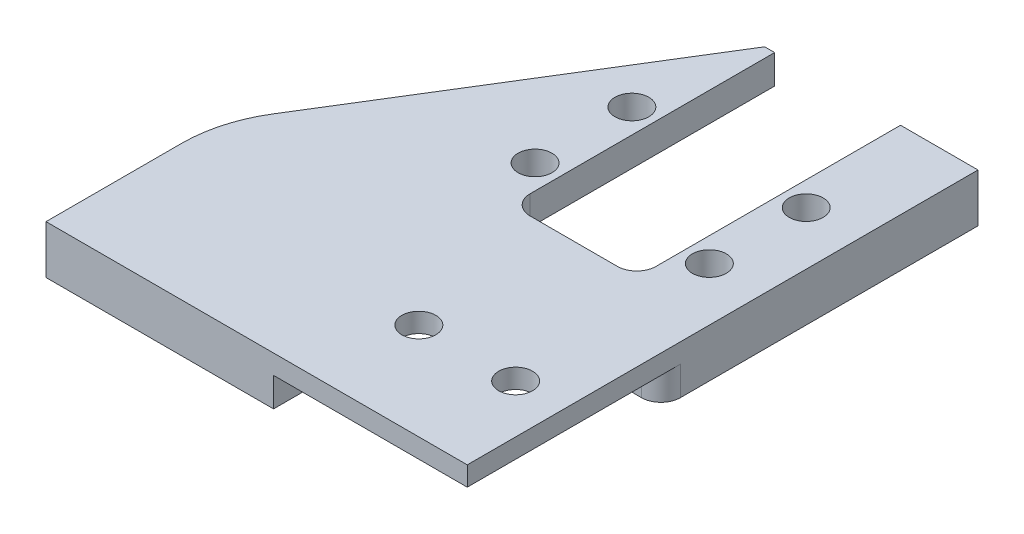
ISO-10303-21;
HEADER;
FILE_DESCRIPTION(('STEP AP214'),'2;1');
FILE_NAME('part.step','',(''),(''),'','','');
FILE_SCHEMA(('AUTOMOTIVE_DESIGN { 1 0 10303 214 1 1 1 1 }'));
ENDSEC;
DATA;
#1=APPLICATION_CONTEXT('core data for automotive mechanical design processes');
#2=APPLICATION_PROTOCOL_DEFINITION('international standard','automotive_design',2000,#1);
#3=PRODUCT_CONTEXT('',#1,'mechanical');
#4=PRODUCT('Part','Part','',(#3));
#5=PRODUCT_RELATED_PRODUCT_CATEGORY('part','',(#4));
#6=PRODUCT_DEFINITION_FORMATION('','',#4);
#7=PRODUCT_DEFINITION_CONTEXT('part definition',#1,'design');
#8=PRODUCT_DEFINITION('design','',#6,#7);
#9=PRODUCT_DEFINITION_SHAPE('','',#8);
#10=(LENGTH_UNIT() NAMED_UNIT(*) SI_UNIT(.MILLI.,.METRE.));
#11=(NAMED_UNIT(*) PLANE_ANGLE_UNIT() SI_UNIT($,.RADIAN.));
#12=(NAMED_UNIT(*) SI_UNIT($,.STERADIAN.) SOLID_ANGLE_UNIT());
#13=UNCERTAINTY_MEASURE_WITH_UNIT(LENGTH_MEASURE(1.E-05),#10,'distance_accuracy_value','');
#14=(GEOMETRIC_REPRESENTATION_CONTEXT(3) GLOBAL_UNCERTAINTY_ASSIGNED_CONTEXT((#13)) GLOBAL_UNIT_ASSIGNED_CONTEXT((#10,
#11,#12)) REPRESENTATION_CONTEXT('',''));
#15=CARTESIAN_POINT('',(0.,0.,0.));
#16=DIRECTION('',(0.,0.,1.));
#17=DIRECTION('',(1.,0.,0.));
#18=AXIS2_PLACEMENT_3D('',#15,#16,#17);
#19=CARTESIAN_POINT('',(121.75,4.,-9.));
#20=DIRECTION('',(0.,1.,0.));
#21=DIRECTION('',(0.,0.,1.));
#22=AXIS2_PLACEMENT_3D('',#19,#20,#21);
#23=PLANE('',#22);
#24=CARTESIAN_POINT('',(-48.25,4.,-16.25));
#25=DIRECTION('',(0.,-1.,0.));
#26=DIRECTION('',(0.,0.,-1.));
#27=AXIS2_PLACEMENT_3D('',#24,#25,#26);
#28=CIRCLE('',#27,7.);
#29=CARTESIAN_POINT('',(-48.25,4.,-23.25));
#30=VERTEX_POINT('',#29);
#31=EDGE_CURVE('E447',#30,#30,#28,.T.);
#32=ORIENTED_EDGE('',*,*,#31,.F.);
#33=EDGE_LOOP('',(#32));
#34=FACE_BOUND('',#33,.T.);
#35=DIRECTION('',(0.,0.,-1.));
#36=VECTOR('',#35,1.);
#37=CARTESIAN_POINT('',(-18.75,4.,-9.00000000000005));
#38=LINE('',#37,#36);
#39=CARTESIAN_POINT('',(-18.75,4.,-24.25));
#40=VERTEX_POINT('',#39);
#41=CARTESIAN_POINT('',(-18.75,4.,-54.9920433000686));
#42=VERTEX_POINT('',#41);
#43=EDGE_CURVE('E538',#40,#42,#38,.T.);
#44=ORIENTED_EDGE('',*,*,#43,.F.);
#45=CARTESIAN_POINT('',(-20.75,4.,-24.25));
#46=DIRECTION('',(0.,1.,0.));
#47=DIRECTION('',(0.,0.,1.));
#48=AXIS2_PLACEMENT_3D('',#45,#46,#47);
#49=CIRCLE('',#48,2.);
#50=CARTESIAN_POINT('',(-20.75,4.,-22.25));
#51=VERTEX_POINT('',#50);
#52=EDGE_CURVE('E310',#40,#51,#49,.F.);
#53=ORIENTED_EDGE('',*,*,#52,.T.);
#54=DIRECTION('',(1.,0.,0.));
#55=VECTOR('',#54,1.);
#56=CARTESIAN_POINT('',(-18.75,4.,-22.25));
#57=LINE('',#56,#55);
#58=CARTESIAN_POINT('',(-36.75,4.,-22.25));
#59=VERTEX_POINT('',#58);
#60=EDGE_CURVE('E215',#59,#51,#57,.T.);
#61=ORIENTED_EDGE('',*,*,#60,.F.);
#62=CARTESIAN_POINT('',(-36.75,4.,-20.25));
#63=DIRECTION('',(0.,1.,0.));
#64=DIRECTION('',(0.,0.,1.));
#65=AXIS2_PLACEMENT_3D('',#62,#63,#64);
#66=CIRCLE('',#65,2.);
#67=CARTESIAN_POINT('',(-38.75,4.,-20.25));
#68=VERTEX_POINT('',#67);
#69=EDGE_CURVE('E12',#59,#68,#66,.T.);
#70=ORIENTED_EDGE('',*,*,#69,.T.);
#71=DIRECTION('',(0.,0.,-1.));
#72=VECTOR('',#71,1.);
#73=CARTESIAN_POINT('',(-38.75,4.,-2.25));
#74=LINE('',#73,#72);
#75=CARTESIAN_POINT('',(-38.75,4.,-2.25));
#76=VERTEX_POINT('',#75);
#77=EDGE_CURVE('E557',#76,#68,#74,.T.);
#78=ORIENTED_EDGE('',*,*,#77,.F.);
#79=DIRECTION('',(1.,0.,0.));
#80=VECTOR('',#79,1.);
#81=CARTESIAN_POINT('',(-62.25,4.,-2.25));
#82=LINE('',#81,#80);
#83=CARTESIAN_POINT('',(-62.25,4.,-2.25));
#84=VERTEX_POINT('',#83);
#85=EDGE_CURVE('E247',#84,#76,#82,.T.);
#86=ORIENTED_EDGE('',*,*,#85,.F.);
#87=DIRECTION('',(0.,0.,-1.));
#88=VECTOR('',#87,1.);
#89=CARTESIAN_POINT('',(-62.25,4.,0.));
#90=LINE('',#89,#88);
#91=CARTESIAN_POINT('',(-62.25,4.,-16.25));
#92=VERTEX_POINT('',#91);
#93=EDGE_CURVE('E232',#84,#92,#90,.T.);
#94=ORIENTED_EDGE('',*,*,#93,.T.);
#95=CARTESIAN_POINT('',(-48.25,4.,-16.25));
#96=DIRECTION('',(0.,-1.,0.));
#97=DIRECTION('',(0.,0.,-1.));
#98=AXIS2_PLACEMENT_3D('',#95,#96,#97);
#99=CIRCLE('',#98,14.);
#100=CARTESIAN_POINT('',(-60.1617921727393,4.,-23.6058960863696));
#101=VERTEX_POINT('',#100);
#102=EDGE_CURVE('E238',#92,#101,#99,.T.);
#103=ORIENTED_EDGE('',*,*,#102,.T.);
#104=DIRECTION('',(-0.525421149026402,0.,0.850842298052803));
#105=VECTOR('',#104,1.);
#106=CARTESIAN_POINT('',(-34.4694758388832,4.,-65.2108248417198));
#107=LINE('',#106,#105);
#108=CARTESIAN_POINT('',(-45.75,4.,-46.9436745409189));
#109=VERTEX_POINT('',#108);
#110=EDGE_CURVE('E250',#109,#101,#107,.T.);
#111=ORIENTED_EDGE('',*,*,#110,.F.);
#112=DIRECTION('',(0.,0.,-1.));
#113=VECTOR('',#112,1.);
#114=CARTESIAN_POINT('',(-45.75,4.,-9.00000000000006));
#115=LINE('',#114,#113);
#116=CARTESIAN_POINT('',(-45.75,4.,-29.75));
#117=VERTEX_POINT('',#116);
#118=EDGE_CURVE('E269',#117,#109,#115,.T.);
#119=ORIENTED_EDGE('',*,*,#118,.F.);
#120=CARTESIAN_POINT('',(-43.75,4.,-29.75));
#121=DIRECTION('',(0.,1.,0.));
#122=DIRECTION('',(0.,0.,1.));
#123=AXIS2_PLACEMENT_3D('',#120,#121,#122);
#124=CIRCLE('',#123,2.);
#125=CARTESIAN_POINT('',(-43.75,4.,-27.75));
#126=VERTEX_POINT('',#125);
#127=EDGE_CURVE('E340',#117,#126,#124,.T.);
#128=ORIENTED_EDGE('',*,*,#127,.T.);
#129=DIRECTION('',(1.,0.,0.));
#130=VECTOR('',#129,1.);
#131=CARTESIAN_POINT('',(121.75,4.,-27.75));
#132=LINE('',#131,#130);
#133=CARTESIAN_POINT('',(-22.75,4.,-27.75));
#134=VERTEX_POINT('',#133);
#135=EDGE_CURVE('E265',#126,#134,#132,.T.);
#136=ORIENTED_EDGE('',*,*,#135,.T.);
#137=CARTESIAN_POINT('',(-22.75,4.,-29.75));
#138=DIRECTION('',(0.,1.,0.));
#139=DIRECTION('',(0.,0.,1.));
#140=AXIS2_PLACEMENT_3D('',#137,#138,#139);
#141=CIRCLE('',#140,2.);
#142=CARTESIAN_POINT('',(-20.75,4.,-29.75));
#143=VERTEX_POINT('',#142);
#144=EDGE_CURVE('E324',#134,#143,#141,.T.);
#145=ORIENTED_EDGE('',*,*,#144,.T.);
#146=DIRECTION('',(0.,0.,-1.));
#147=VECTOR('',#146,1.);
#148=CARTESIAN_POINT('',(-20.75,4.,-9.));
#149=LINE('',#148,#147);
#150=CARTESIAN_POINT('',(-20.75,4.,-54.9920433000686));
#151=VERTEX_POINT('',#150);
#152=EDGE_CURVE('E392',#143,#151,#149,.T.);
#153=ORIENTED_EDGE('',*,*,#152,.T.);
#154=DIRECTION('',(1.,0.,0.));
#155=VECTOR('',#154,1.);
#156=CARTESIAN_POINT('',(121.75,4.,-54.9920433000686));
#157=LINE('',#156,#155);
#158=EDGE_CURVE('E533',#151,#42,#157,.T.);
#159=ORIENTED_EDGE('',*,*,#158,.T.);
#160=EDGE_LOOP('',(#44,#53,#61,#70,#78,#86,#94,#103,#111,#119,#128,#136,#145,#153,#159));
#161=FACE_BOUND('',#160,.T.);
#162=ADVANCED_FACE('F46',(#34,#161),#23,.F.);
#163=CARTESIAN_POINT('',(0.,4.,-2.25));
#164=DIRECTION('',(0.,0.,-1.));
#165=DIRECTION('',(-1.,0.,0.));
#166=AXIS2_PLACEMENT_3D('',#163,#164,#165);
#167=PLANE('',#166);
#168=ORIENTED_EDGE('',*,*,#85,.T.);
#169=DIRECTION('',(0.,-1.,0.));
#170=VECTOR('',#169,1.);
#171=CARTESIAN_POINT('',(-38.75,7.,-2.25));
#172=LINE('',#171,#170);
#173=CARTESIAN_POINT('',(-38.75,7.,-2.25));
#174=VERTEX_POINT('',#173);
#175=EDGE_CURVE('E223',#174,#76,#172,.T.);
#176=ORIENTED_EDGE('',*,*,#175,.F.);
#177=DIRECTION('',(-1.,0.,0.));
#178=VECTOR('',#177,1.);
#179=CARTESIAN_POINT('',(-18.75,7.,-2.25));
#180=LINE('',#179,#178);
#181=CARTESIAN_POINT('',(-18.75,7.,-2.25));
#182=VERTEX_POINT('',#181);
#183=EDGE_CURVE('E207',#182,#174,#180,.T.);
#184=ORIENTED_EDGE('',*,*,#183,.F.);
#185=DIRECTION('',(0.,-1.,0.));
#186=VECTOR('',#185,1.);
#187=CARTESIAN_POINT('',(-18.75,9.,-2.25));
#188=LINE('',#187,#186);
#189=CARTESIAN_POINT('',(-18.75,9.,-2.25));
#190=VERTEX_POINT('',#189);
#191=EDGE_CURVE('E222',#190,#182,#188,.T.);
#192=ORIENTED_EDGE('',*,*,#191,.F.);
#193=DIRECTION('',(1.,0.,0.));
#194=VECTOR('',#193,1.);
#195=CARTESIAN_POINT('',(0.,9.,-2.25));
#196=LINE('',#195,#194);
#197=CARTESIAN_POINT('',(-62.25,9.,-2.25));
#198=VERTEX_POINT('',#197);
#199=EDGE_CURVE('E414',#198,#190,#196,.T.);
#200=ORIENTED_EDGE('',*,*,#199,.F.);
#201=DIRECTION('',(0.,-1.,0.));
#202=VECTOR('',#201,1.);
#203=CARTESIAN_POINT('',(-62.25,7.,-2.25));
#204=LINE('',#203,#202);
#205=EDGE_CURVE('E253',#198,#84,#204,.T.);
#206=ORIENTED_EDGE('',*,*,#205,.T.);
#207=EDGE_LOOP('',(#168,#176,#184,#192,#200,#206));
#208=FACE_BOUND('',#207,.T.);
#209=ADVANCED_FACE('F220',(#208),#167,.F.);
#210=CARTESIAN_POINT('',(-26.75,-12.,-27.75));
#211=DIRECTION('',(1.,0.,0.));
#212=DIRECTION('',(0.,0.,-1.));
#213=AXIS2_PLACEMENT_3D('',#210,#211,#212);
#214=PLANE('',#213);
#215=DIRECTION('',(0.,0.,1.));
#216=VECTOR('',#215,1.);
#217=CARTESIAN_POINT('',(-26.75,6.,0.));
#218=LINE('',#217,#216);
#219=CARTESIAN_POINT('',(-26.75,6.,-54.9920433000686));
#220=VERTEX_POINT('',#219);
#221=CARTESIAN_POINT('',(-26.75,6.,-29.75));
#222=VERTEX_POINT('',#221);
#223=EDGE_CURVE('E375',#220,#222,#218,.T.);
#224=ORIENTED_EDGE('',*,*,#223,.T.);
#225=DIRECTION('',(0.,1.,0.));
#226=VECTOR('',#225,1.);
#227=CARTESIAN_POINT('',(-26.75,9.,-29.75));
#228=LINE('',#227,#226);
#229=CARTESIAN_POINT('',(-26.75,9.,-29.75));
#230=VERTEX_POINT('',#229);
#231=EDGE_CURVE('E294',#222,#230,#228,.T.);
#232=ORIENTED_EDGE('',*,*,#231,.T.);
#233=DIRECTION('',(0.,0.,1.));
#234=VECTOR('',#233,1.);
#235=CARTESIAN_POINT('',(-26.75,9.,0.));
#236=LINE('',#235,#234);
#237=CARTESIAN_POINT('',(-26.75,9.,-54.9920433000686));
#238=VERTEX_POINT('',#237);
#239=EDGE_CURVE('E233',#238,#230,#236,.T.);
#240=ORIENTED_EDGE('',*,*,#239,.F.);
#241=DIRECTION('',(0.,-1.,0.));
#242=VECTOR('',#241,1.);
#243=CARTESIAN_POINT('',(-26.75,-12.,-54.9920433000686));
#244=LINE('',#243,#242);
#245=EDGE_CURVE('E501',#238,#220,#244,.T.);
#246=ORIENTED_EDGE('',*,*,#245,.T.);
#247=EDGE_LOOP('',(#224,#232,#240,#246));
#248=FACE_BOUND('',#247,.T.);
#249=ADVANCED_FACE('F606',(#248),#214,.F.);
#250=CARTESIAN_POINT('',(-18.75,9.,0.));
#251=DIRECTION('',(1.,0.,0.));
#252=DIRECTION('',(0.,0.,-1.));
#253=AXIS2_PLACEMENT_3D('',#250,#251,#252);
#254=PLANE('',#253);
#255=DIRECTION('',(0.,0.,1.));
#256=VECTOR('',#255,1.);
#257=CARTESIAN_POINT('',(-18.75,7.,-2.25));
#258=LINE('',#257,#256);
#259=CARTESIAN_POINT('',(-18.75,7.,-24.25));
#260=VERTEX_POINT('',#259);
#261=EDGE_CURVE('E204',#260,#182,#258,.T.);
#262=ORIENTED_EDGE('',*,*,#261,.F.);
#263=DIRECTION('',(0.,-1.,0.));
#264=VECTOR('',#263,1.);
#265=CARTESIAN_POINT('',(-18.75,4.,-24.25));
#266=LINE('',#265,#264);
#267=EDGE_CURVE('E307',#260,#40,#266,.T.);
#268=ORIENTED_EDGE('',*,*,#267,.T.);
#269=ORIENTED_EDGE('',*,*,#43,.T.);
#270=DIRECTION('',(0.,1.,0.));
#271=VECTOR('',#270,1.);
#272=CARTESIAN_POINT('',(-18.75,5.,-54.9920433000686));
#273=LINE('',#272,#271);
#274=CARTESIAN_POINT('',(-18.75,9.,-54.9920433000686));
#275=VERTEX_POINT('',#274);
#276=EDGE_CURVE('E492',#42,#275,#273,.T.);
#277=ORIENTED_EDGE('',*,*,#276,.T.);
#278=DIRECTION('',(0.,0.,1.));
#279=VECTOR('',#278,1.);
#280=CARTESIAN_POINT('',(-18.75,9.,0.));
#281=LINE('',#280,#279);
#282=EDGE_CURVE('E229',#275,#190,#281,.T.);
#283=ORIENTED_EDGE('',*,*,#282,.T.);
#284=ORIENTED_EDGE('',*,*,#191,.T.);
#285=EDGE_LOOP('',(#262,#268,#269,#277,#283,#284));
#286=FACE_BOUND('',#285,.T.);
#287=ADVANCED_FACE('F227',(#286),#254,.T.);
#288=CARTESIAN_POINT('',(0.,9.,0.));
#289=DIRECTION('',(0.,1.,0.));
#290=DIRECTION('',(0.,0.,1.));
#291=AXIS2_PLACEMENT_3D('',#288,#289,#290);
#292=PLANE('',#291);
#293=CARTESIAN_POINT('',(-23.75,9.,-12.25));
#294=DIRECTION('',(0.,1.,0.));
#295=DIRECTION('',(0.,0.,1.));
#296=AXIS2_PLACEMENT_3D('',#293,#294,#295);
#297=CIRCLE('',#296,1.75);
#298=CARTESIAN_POINT('',(-23.75,9.,-10.5));
#299=VERTEX_POINT('',#298);
#300=EDGE_CURVE('E561',#299,#299,#297,.T.);
#301=ORIENTED_EDGE('',*,*,#300,.F.);
#302=EDGE_LOOP('',(#301));
#303=FACE_BOUND('',#302,.T.);
#304=CARTESIAN_POINT('',(-33.75,9.,-12.25));
#305=DIRECTION('',(0.,1.,0.));
#306=DIRECTION('',(0.,0.,1.));
#307=AXIS2_PLACEMENT_3D('',#304,#305,#306);
#308=CIRCLE('',#307,1.75);
#309=CARTESIAN_POINT('',(-33.75,9.,-10.5));
#310=VERTEX_POINT('',#309);
#311=EDGE_CURVE('E566',#310,#310,#308,.T.);
#312=ORIENTED_EDGE('',*,*,#311,.F.);
#313=EDGE_LOOP('',(#312));
#314=FACE_BOUND('',#313,.T.);
#315=DIRECTION('',(1.,0.,0.));
#316=VECTOR('',#315,1.);
#317=CARTESIAN_POINT('',(0.,9.,-54.9920433000686));
#318=LINE('',#317,#316);
#319=CARTESIAN_POINT('',(-40.7798860659626,9.,-54.9920433000686));
#320=VERTEX_POINT('',#319);
#321=CARTESIAN_POINT('',(-39.75,9.,-54.9920433000686));
#322=VERTEX_POINT('',#321);
#323=EDGE_CURVE('E503',#320,#322,#318,.T.);
#324=ORIENTED_EDGE('',*,*,#323,.F.);
#325=DIRECTION('',(-0.525421149026402,0.,0.850842298052804));
#326=VECTOR('',#325,1.);
#327=CARTESIAN_POINT('',(-54.1061121428569,9.,-33.4121795267011));
#328=LINE('',#327,#326);
#329=CARTESIAN_POINT('',(-60.1617921727393,9.,-23.6058960863696));
#330=VERTEX_POINT('',#329);
#331=EDGE_CURVE('E403',#320,#330,#328,.T.);
#332=ORIENTED_EDGE('',*,*,#331,.T.);
#333=CARTESIAN_POINT('',(-48.25,9.,-16.25));
#334=DIRECTION('',(0.,1.,0.));
#335=DIRECTION('',(0.,0.,1.));
#336=AXIS2_PLACEMENT_3D('',#333,#334,#335);
#337=CIRCLE('',#336,14.);
#338=CARTESIAN_POINT('',(-62.25,9.,-16.25));
#339=VERTEX_POINT('',#338);
#340=EDGE_CURVE('E406',#330,#339,#337,.T.);
#341=ORIENTED_EDGE('',*,*,#340,.T.);
#342=DIRECTION('',(0.,0.,1.));
#343=VECTOR('',#342,1.);
#344=CARTESIAN_POINT('',(-62.25,9.,0.));
#345=LINE('',#344,#343);
#346=EDGE_CURVE('E410',#339,#198,#345,.T.);
#347=ORIENTED_EDGE('',*,*,#346,.T.);
#348=ORIENTED_EDGE('',*,*,#199,.T.);
#349=ORIENTED_EDGE('',*,*,#282,.F.);
#350=EDGE_CURVE('E496',#238,#275,#318,.T.);
#351=ORIENTED_EDGE('',*,*,#350,.F.);
#352=ORIENTED_EDGE('',*,*,#239,.T.);
#353=CARTESIAN_POINT('',(-28.75,9.,-29.75));
#354=DIRECTION('',(0.,1.,0.));
#355=DIRECTION('',(0.,0.,1.));
#356=AXIS2_PLACEMENT_3D('',#353,#354,#355);
#357=CIRCLE('',#356,2.);
#358=CARTESIAN_POINT('',(-28.75,9.,-27.75));
#359=VERTEX_POINT('',#358);
#360=EDGE_CURVE('E327',#230,#359,#357,.F.);
#361=ORIENTED_EDGE('',*,*,#360,.T.);
#362=DIRECTION('',(1.,0.,0.));
#363=VECTOR('',#362,1.);
#364=CARTESIAN_POINT('',(0.,9.,-27.75));
#365=LINE('',#364,#363);
#366=CARTESIAN_POINT('',(-37.75,9.,-27.75));
#367=VERTEX_POINT('',#366);
#368=EDGE_CURVE('E395',#367,#359,#365,.T.);
#369=ORIENTED_EDGE('',*,*,#368,.F.);
#370=CARTESIAN_POINT('',(-37.75,9.,-29.75));
#371=DIRECTION('',(0.,1.,0.));
#372=DIRECTION('',(0.,0.,1.));
#373=AXIS2_PLACEMENT_3D('',#370,#371,#372);
#374=CIRCLE('',#373,2.);
#375=CARTESIAN_POINT('',(-39.75,9.,-29.75));
#376=VERTEX_POINT('',#375);
#377=EDGE_CURVE('E333',#367,#376,#374,.F.);
#378=ORIENTED_EDGE('',*,*,#377,.T.);
#379=DIRECTION('',(0.,0.,-1.));
#380=VECTOR('',#379,1.);
#381=CARTESIAN_POINT('',(-39.75,9.,0.));
#382=LINE('',#381,#380);
#383=EDGE_CURVE('E400',#376,#322,#382,.T.);
#384=ORIENTED_EDGE('',*,*,#383,.T.);
#385=EDGE_LOOP('',(#324,#332,#341,#347,#348,#349,#351,#352,#361,#369,#378,#384));
#386=FACE_BOUND('',#385,.T.);
#387=CARTESIAN_POINT('',(-42.25,9.,-42.75));
#388=DIRECTION('',(0.,1.,0.));
#389=DIRECTION('',(0.,0.,1.));
#390=AXIS2_PLACEMENT_3D('',#387,#388,#389);
#391=CIRCLE('',#390,1.75);
#392=CARTESIAN_POINT('',(-42.25,9.,-41.));
#393=VERTEX_POINT('',#392);
#394=EDGE_CURVE('E452',#393,#393,#391,.T.);
#395=ORIENTED_EDGE('',*,*,#394,.F.);
#396=EDGE_LOOP('',(#395));
#397=FACE_BOUND('',#396,.T.);
#398=CARTESIAN_POINT('',(-24.25,9.,-32.75));
#399=DIRECTION('',(0.,1.,0.));
#400=DIRECTION('',(0.,0.,1.));
#401=AXIS2_PLACEMENT_3D('',#398,#399,#400);
#402=CIRCLE('',#401,1.75);
#403=CARTESIAN_POINT('',(-24.25,9.,-31.));
#404=VERTEX_POINT('',#403);
#405=EDGE_CURVE('E462',#404,#404,#402,.T.);
#406=ORIENTED_EDGE('',*,*,#405,.F.);
#407=EDGE_LOOP('',(#406));
#408=FACE_BOUND('',#407,.T.);
#409=CARTESIAN_POINT('',(-24.25,9.,-42.75));
#410=DIRECTION('',(0.,1.,0.));
#411=DIRECTION('',(0.,0.,1.));
#412=AXIS2_PLACEMENT_3D('',#409,#410,#411);
#413=CIRCLE('',#412,1.75);
#414=CARTESIAN_POINT('',(-24.25,9.,-41.));
#415=VERTEX_POINT('',#414);
#416=EDGE_CURVE('E467',#415,#415,#413,.T.);
#417=ORIENTED_EDGE('',*,*,#416,.F.);
#418=EDGE_LOOP('',(#417));
#419=FACE_BOUND('',#418,.T.);
#420=CARTESIAN_POINT('',(-42.25,9.,-32.75));
#421=DIRECTION('',(0.,1.,0.));
#422=DIRECTION('',(0.,0.,1.));
#423=AXIS2_PLACEMENT_3D('',#420,#421,#422);
#424=CIRCLE('',#423,1.75);
#425=CARTESIAN_POINT('',(-42.25,9.,-31.));
#426=VERTEX_POINT('',#425);
#427=EDGE_CURVE('E457',#426,#426,#424,.T.);
#428=ORIENTED_EDGE('',*,*,#427,.F.);
#429=EDGE_LOOP('',(#428));
#430=FACE_BOUND('',#429,.T.);
#431=ADVANCED_FACE('F662',(#303,#314,#386,#397,#408,#419,#430),#292,.T.);
#432=CARTESIAN_POINT('',(-20.75,-12.,0.));
#433=DIRECTION('',(1.,0.,0.));
#434=DIRECTION('',(0.,0.,-1.));
#435=AXIS2_PLACEMENT_3D('',#432,#433,#434);
#436=PLANE('',#435);
#437=ORIENTED_EDGE('',*,*,#152,.F.);
#438=DIRECTION('',(0.,1.,0.));
#439=VECTOR('',#438,1.);
#440=CARTESIAN_POINT('',(-20.75,6.,-29.75));
#441=LINE('',#440,#439);
#442=CARTESIAN_POINT('',(-20.75,6.,-29.75));
#443=VERTEX_POINT('',#442);
#444=EDGE_CURVE('E272',#143,#443,#441,.T.);
#445=ORIENTED_EDGE('',*,*,#444,.T.);
#446=DIRECTION('',(0.,0.,-1.));
#447=VECTOR('',#446,1.);
#448=CARTESIAN_POINT('',(-20.75,6.,0.));
#449=LINE('',#448,#447);
#450=CARTESIAN_POINT('',(-20.75,6.,-54.9920433000686));
#451=VERTEX_POINT('',#450);
#452=EDGE_CURVE('E379',#443,#451,#449,.T.);
#453=ORIENTED_EDGE('',*,*,#452,.T.);
#454=DIRECTION('',(0.,-1.,0.));
#455=VECTOR('',#454,1.);
#456=CARTESIAN_POINT('',(-20.75,-12.,-54.9920433000686));
#457=LINE('',#456,#455);
#458=EDGE_CURVE('E506',#451,#151,#457,.T.);
#459=ORIENTED_EDGE('',*,*,#458,.T.);
#460=EDGE_LOOP('',(#437,#445,#453,#459));
#461=FACE_BOUND('',#460,.T.);
#462=ADVANCED_FACE('F699',(#461),#436,.F.);
#463=CARTESIAN_POINT('',(0.,6.,0.));
#464=DIRECTION('',(0.,1.,0.));
#465=DIRECTION('',(0.,0.,1.));
#466=AXIS2_PLACEMENT_3D('',#463,#464,#465);
#467=PLANE('',#466);
#468=CARTESIAN_POINT('',(-24.25,6.,-42.75));
#469=DIRECTION('',(0.,-1.,0.));
#470=DIRECTION('',(0.,0.,-1.));
#471=AXIS2_PLACEMENT_3D('',#468,#469,#470);
#472=CIRCLE('',#471,1.75);
#473=CARTESIAN_POINT('',(-24.25,6.,-44.5));
#474=VERTEX_POINT('',#473);
#475=EDGE_CURVE('E487',#474,#474,#472,.T.);
#476=ORIENTED_EDGE('',*,*,#475,.F.);
#477=EDGE_LOOP('',(#476));
#478=FACE_BOUND('',#477,.T.);
#479=CARTESIAN_POINT('',(-24.25,6.,-32.75));
#480=DIRECTION('',(0.,-1.,0.));
#481=DIRECTION('',(0.,0.,-1.));
#482=AXIS2_PLACEMENT_3D('',#479,#480,#481);
#483=CIRCLE('',#482,1.75);
#484=CARTESIAN_POINT('',(-24.25,6.,-34.5));
#485=VERTEX_POINT('',#484);
#486=EDGE_CURVE('E482',#485,#485,#483,.T.);
#487=ORIENTED_EDGE('',*,*,#486,.F.);
#488=EDGE_LOOP('',(#487));
#489=FACE_BOUND('',#488,.T.);
#490=ORIENTED_EDGE('',*,*,#452,.F.);
#491=CARTESIAN_POINT('',(-22.75,6.,-29.75));
#492=DIRECTION('',(0.,1.,0.));
#493=DIRECTION('',(0.,0.,1.));
#494=AXIS2_PLACEMENT_3D('',#491,#492,#493);
#495=CIRCLE('',#494,2.);
#496=CARTESIAN_POINT('',(-22.75,6.,-27.75));
#497=VERTEX_POINT('',#496);
#498=EDGE_CURVE('E276',#443,#497,#495,.F.);
#499=ORIENTED_EDGE('',*,*,#498,.T.);
#500=DIRECTION('',(1.,0.,0.));
#501=VECTOR('',#500,1.);
#502=CARTESIAN_POINT('',(0.,6.,-27.75));
#503=LINE('',#502,#501);
#504=CARTESIAN_POINT('',(-28.75,6.,-27.75));
#505=VERTEX_POINT('',#504);
#506=EDGE_CURVE('E388',#505,#497,#503,.T.);
#507=ORIENTED_EDGE('',*,*,#506,.F.);
#508=CARTESIAN_POINT('',(-28.75,6.,-29.75));
#509=DIRECTION('',(0.,1.,0.));
#510=DIRECTION('',(0.,0.,1.));
#511=AXIS2_PLACEMENT_3D('',#508,#509,#510);
#512=CIRCLE('',#511,2.);
#513=EDGE_CURVE('E330',#505,#222,#512,.T.);
#514=ORIENTED_EDGE('',*,*,#513,.T.);
#515=ORIENTED_EDGE('',*,*,#223,.F.);
#516=DIRECTION('',(1.,0.,0.));
#517=VECTOR('',#516,1.);
#518=CARTESIAN_POINT('',(0.,6.,-54.9920433000686));
#519=LINE('',#518,#517);
#520=EDGE_CURVE('E511',#220,#451,#519,.T.);
#521=ORIENTED_EDGE('',*,*,#520,.T.);
#522=EDGE_LOOP('',(#490,#499,#507,#514,#515,#521));
#523=FACE_BOUND('',#522,.T.);
#524=ADVANCED_FACE('F625',(#478,#489,#523),#467,.F.);
#525=CARTESIAN_POINT('',(-54.1061121428569,4.,-33.4121795267011));
#526=DIRECTION('',(-0.850842298052804,0.,-0.525421149026402));
#527=DIRECTION('',(-0.525421149026402,0.,0.850842298052804));
#528=AXIS2_PLACEMENT_3D('',#525,#526,#527);
#529=PLANE('',#528);
#530=DIRECTION('',(0.,1.,0.));
#531=VECTOR('',#530,1.);
#532=CARTESIAN_POINT('',(-40.7798860659626,4.,-54.9920433000686));
#533=LINE('',#532,#531);
#534=CARTESIAN_POINT('',(-40.7798860659626,6.,-54.9920433000686));
#535=VERTEX_POINT('',#534);
#536=EDGE_CURVE('E520',#535,#320,#533,.T.);
#537=ORIENTED_EDGE('',*,*,#536,.F.);
#538=DIRECTION('',(-0.525421149026402,0.,0.850842298052804));
#539=VECTOR('',#538,1.);
#540=CARTESIAN_POINT('',(-54.1061121428569,6.,-33.4121795267011));
#541=LINE('',#540,#539);
#542=CARTESIAN_POINT('',(-45.75,6.,-46.9436745409189));
#543=VERTEX_POINT('',#542);
#544=EDGE_CURVE('E372',#535,#543,#541,.T.);
#545=ORIENTED_EDGE('',*,*,#544,.T.);
#546=DIRECTION('',(0.,1.,0.));
#547=VECTOR('',#546,1.);
#548=CARTESIAN_POINT('',(-45.75,-12.,-46.9436745409189));
#549=LINE('',#548,#547);
#550=EDGE_CURVE('E396',#109,#543,#549,.T.);
#551=ORIENTED_EDGE('',*,*,#550,.F.);
#552=ORIENTED_EDGE('',*,*,#110,.T.);
#553=DIRECTION('',(0.,-1.,0.));
#554=VECTOR('',#553,1.);
#555=CARTESIAN_POINT('',(-60.1617921727393,4.,-23.6058960863696));
#556=LINE('',#555,#554);
#557=EDGE_CURVE('E261',#330,#101,#556,.T.);
#558=ORIENTED_EDGE('',*,*,#557,.F.);
#559=ORIENTED_EDGE('',*,*,#331,.F.);
#560=EDGE_LOOP('',(#537,#545,#551,#552,#558,#559));
#561=FACE_BOUND('',#560,.T.);
#562=ADVANCED_FACE('F623',(#561),#529,.T.);
#563=CARTESIAN_POINT('',(0.,-12.,-27.75));
#564=DIRECTION('',(0.,0.,1.));
#565=DIRECTION('',(1.,0.,0.));
#566=AXIS2_PLACEMENT_3D('',#563,#564,#565);
#567=PLANE('',#566);
#568=ORIENTED_EDGE('',*,*,#506,.T.);
#569=DIRECTION('',(0.,1.,0.));
#570=VECTOR('',#569,1.);
#571=CARTESIAN_POINT('',(-22.75,4.,-27.75));
#572=LINE('',#571,#570);
#573=EDGE_CURVE('E291',#497,#134,#572,.F.);
#574=ORIENTED_EDGE('',*,*,#573,.T.);
#575=ORIENTED_EDGE('',*,*,#135,.F.);
#576=DIRECTION('',(0.,1.,0.));
#577=VECTOR('',#576,1.);
#578=CARTESIAN_POINT('',(-43.75,-12.,-27.75));
#579=LINE('',#578,#577);
#580=CARTESIAN_POINT('',(-43.75,6.,-27.75));
#581=VERTEX_POINT('',#580);
#582=EDGE_CURVE('E279',#126,#581,#579,.T.);
#583=ORIENTED_EDGE('',*,*,#582,.T.);
#584=DIRECTION('',(1.,0.,0.));
#585=VECTOR('',#584,1.);
#586=CARTESIAN_POINT('',(0.,6.,-27.75));
#587=LINE('',#586,#585);
#588=CARTESIAN_POINT('',(-37.75,6.,-27.75));
#589=VERTEX_POINT('',#588);
#590=EDGE_CURVE('E373',#581,#589,#587,.T.);
#591=ORIENTED_EDGE('',*,*,#590,.T.);
#592=DIRECTION('',(0.,1.,0.));
#593=VECTOR('',#592,1.);
#594=CARTESIAN_POINT('',(-37.75,9.,-27.75));
#595=LINE('',#594,#593);
#596=EDGE_CURVE('E283',#589,#367,#595,.T.);
#597=ORIENTED_EDGE('',*,*,#596,.T.);
#598=ORIENTED_EDGE('',*,*,#368,.T.);
#599=DIRECTION('',(0.,1.,0.));
#600=VECTOR('',#599,1.);
#601=CARTESIAN_POINT('',(-28.75,6.,-27.75));
#602=LINE('',#601,#600);
#603=EDGE_CURVE('E287',#359,#505,#602,.F.);
#604=ORIENTED_EDGE('',*,*,#603,.T.);
#605=EDGE_LOOP('',(#568,#574,#575,#583,#591,#597,#598,#604));
#606=FACE_BOUND('',#605,.T.);
#607=ADVANCED_FACE('F612',(#606),#567,.F.);
#608=CARTESIAN_POINT('',(-48.25,4.,-16.25));
#609=DIRECTION('',(0.,-1.,0.));
#610=DIRECTION('',(0.,0.,-1.));
#611=AXIS2_PLACEMENT_3D('',#608,#609,#610);
#612=CYLINDRICAL_SURFACE('',#611,14.);
#613=ORIENTED_EDGE('',*,*,#102,.F.);
#614=DIRECTION('',(0.,-1.,0.));
#615=VECTOR('',#614,1.);
#616=CARTESIAN_POINT('',(-62.25,4.,-16.25));
#617=LINE('',#616,#615);
#618=EDGE_CURVE('E257',#339,#92,#617,.T.);
#619=ORIENTED_EDGE('',*,*,#618,.F.);
#620=ORIENTED_EDGE('',*,*,#340,.F.);
#621=ORIENTED_EDGE('',*,*,#557,.T.);
#622=EDGE_LOOP('',(#613,#619,#620,#621));
#623=FACE_BOUND('',#622,.T.);
#624=ADVANCED_FACE('F618',(#623),#612,.T.);
#625=CARTESIAN_POINT('',(-62.25,4.,0.));
#626=DIRECTION('',(1.,0.,0.));
#627=DIRECTION('',(0.,0.,-1.));
#628=AXIS2_PLACEMENT_3D('',#625,#626,#627);
#629=PLANE('',#628);
#630=ORIENTED_EDGE('',*,*,#93,.F.);
#631=ORIENTED_EDGE('',*,*,#205,.F.);
#632=ORIENTED_EDGE('',*,*,#346,.F.);
#633=ORIENTED_EDGE('',*,*,#618,.T.);
#634=EDGE_LOOP('',(#630,#631,#632,#633));
#635=FACE_BOUND('',#634,.T.);
#636=ADVANCED_FACE('F614',(#635),#629,.F.);
#637=CARTESIAN_POINT('',(-39.75,-12.,-56.6597923595038));
#638=DIRECTION('',(-1.,0.,0.));
#639=DIRECTION('',(0.,0.,1.));
#640=AXIS2_PLACEMENT_3D('',#637,#638,#639);
#641=PLANE('',#640);
#642=ORIENTED_EDGE('',*,*,#383,.F.);
#643=DIRECTION('',(0.,1.,0.));
#644=VECTOR('',#643,1.);
#645=CARTESIAN_POINT('',(-39.75,6.,-29.75));
#646=LINE('',#645,#644);
#647=CARTESIAN_POINT('',(-39.75,6.,-29.75));
#648=VERTEX_POINT('',#647);
#649=EDGE_CURVE('E298',#376,#648,#646,.F.);
#650=ORIENTED_EDGE('',*,*,#649,.T.);
#651=DIRECTION('',(0.,0.,-1.));
#652=VECTOR('',#651,1.);
#653=CARTESIAN_POINT('',(-39.75,6.,0.));
#654=LINE('',#653,#652);
#655=CARTESIAN_POINT('',(-39.75,6.,-54.9920433000686));
#656=VERTEX_POINT('',#655);
#657=EDGE_CURVE('E369',#648,#656,#654,.T.);
#658=ORIENTED_EDGE('',*,*,#657,.T.);
#659=DIRECTION('',(0.,1.,0.));
#660=VECTOR('',#659,1.);
#661=CARTESIAN_POINT('',(-39.75,-12.,-54.9920433000686));
#662=LINE('',#661,#660);
#663=EDGE_CURVE('E523',#656,#322,#662,.T.);
#664=ORIENTED_EDGE('',*,*,#663,.T.);
#665=EDGE_LOOP('',(#642,#650,#658,#664));
#666=FACE_BOUND('',#665,.T.);
#667=ADVANCED_FACE('F617',(#666),#641,.F.);
#668=CARTESIAN_POINT('',(-45.75,-12.,0.));
#669=DIRECTION('',(1.,0.,0.));
#670=DIRECTION('',(0.,0.,-1.));
#671=AXIS2_PLACEMENT_3D('',#668,#669,#670);
#672=PLANE('',#671);
#673=DIRECTION('',(0.,0.,-1.));
#674=VECTOR('',#673,1.);
#675=CARTESIAN_POINT('',(-45.75,6.,0.));
#676=LINE('',#675,#674);
#677=CARTESIAN_POINT('',(-45.75,6.,-29.75));
#678=VERTEX_POINT('',#677);
#679=EDGE_CURVE('E378',#678,#543,#676,.T.);
#680=ORIENTED_EDGE('',*,*,#679,.F.);
#681=DIRECTION('',(0.,1.,0.));
#682=VECTOR('',#681,1.);
#683=CARTESIAN_POINT('',(-45.75,-12.,-29.75));
#684=LINE('',#683,#682);
#685=EDGE_CURVE('E304',#678,#117,#684,.F.);
#686=ORIENTED_EDGE('',*,*,#685,.T.);
#687=ORIENTED_EDGE('',*,*,#118,.T.);
#688=ORIENTED_EDGE('',*,*,#550,.T.);
#689=EDGE_LOOP('',(#680,#686,#687,#688));
#690=FACE_BOUND('',#689,.T.);
#691=ADVANCED_FACE('F716',(#690),#672,.T.);
#692=CARTESIAN_POINT('',(0.,6.,0.));
#693=DIRECTION('',(0.,1.,0.));
#694=DIRECTION('',(0.,0.,1.));
#695=AXIS2_PLACEMENT_3D('',#692,#693,#694);
#696=PLANE('',#695);
#697=CARTESIAN_POINT('',(-42.25,6.,-42.75));
#698=DIRECTION('',(0.,-1.,0.));
#699=DIRECTION('',(0.,0.,-1.));
#700=AXIS2_PLACEMENT_3D('',#697,#698,#699);
#701=CIRCLE('',#700,1.75);
#702=CARTESIAN_POINT('',(-42.25,6.,-44.5));
#703=VERTEX_POINT('',#702);
#704=EDGE_CURVE('E477',#703,#703,#701,.T.);
#705=ORIENTED_EDGE('',*,*,#704,.F.);
#706=EDGE_LOOP('',(#705));
#707=FACE_BOUND('',#706,.T.);
#708=CARTESIAN_POINT('',(-42.25,6.,-32.75));
#709=DIRECTION('',(0.,-1.,0.));
#710=DIRECTION('',(0.,0.,-1.));
#711=AXIS2_PLACEMENT_3D('',#708,#709,#710);
#712=CIRCLE('',#711,1.75);
#713=CARTESIAN_POINT('',(-42.25,6.,-34.5));
#714=VERTEX_POINT('',#713);
#715=EDGE_CURVE('E472',#714,#714,#712,.T.);
#716=ORIENTED_EDGE('',*,*,#715,.F.);
#717=EDGE_LOOP('',(#716));
#718=FACE_BOUND('',#717,.T.);
#719=ORIENTED_EDGE('',*,*,#590,.F.);
#720=CARTESIAN_POINT('',(-43.75,6.,-29.75));
#721=DIRECTION('',(0.,1.,0.));
#722=DIRECTION('',(0.,0.,1.));
#723=AXIS2_PLACEMENT_3D('',#720,#721,#722);
#724=CIRCLE('',#723,2.);
#725=EDGE_CURVE('E301',#581,#678,#724,.F.);
#726=ORIENTED_EDGE('',*,*,#725,.T.);
#727=ORIENTED_EDGE('',*,*,#679,.T.);
#728=ORIENTED_EDGE('',*,*,#544,.F.);
#729=DIRECTION('',(1.,0.,0.));
#730=VECTOR('',#729,1.);
#731=CARTESIAN_POINT('',(0.,6.,-54.9920433000686));
#732=LINE('',#731,#730);
#733=EDGE_CURVE('E528',#535,#656,#732,.T.);
#734=ORIENTED_EDGE('',*,*,#733,.T.);
#735=ORIENTED_EDGE('',*,*,#657,.F.);
#736=CARTESIAN_POINT('',(-37.75,6.,-29.75));
#737=DIRECTION('',(0.,1.,0.));
#738=DIRECTION('',(0.,0.,1.));
#739=AXIS2_PLACEMENT_3D('',#736,#737,#738);
#740=CIRCLE('',#739,2.);
#741=EDGE_CURVE('E336',#648,#589,#740,.T.);
#742=ORIENTED_EDGE('',*,*,#741,.T.);
#743=EDGE_LOOP('',(#719,#726,#727,#728,#734,#735,#742));
#744=FACE_BOUND('',#743,.T.);
#745=ADVANCED_FACE('F683',(#707,#718,#744),#696,.F.);
#746=CARTESIAN_POINT('',(-48.25,8.,-16.25));
#747=DIRECTION('',(0.,-1.,0.));
#748=DIRECTION('',(0.,0.,-1.));
#749=AXIS2_PLACEMENT_3D('',#746,#747,#748);
#750=PLANE('',#749);
#751=CARTESIAN_POINT('',(-48.25,8.,-16.25));
#752=DIRECTION('',(0.,-1.,0.));
#753=DIRECTION('',(0.,0.,-1.));
#754=AXIS2_PLACEMENT_3D('',#751,#752,#753);
#755=CIRCLE('',#754,7.);
#756=CARTESIAN_POINT('',(-48.25,8.,-23.25));
#757=VERTEX_POINT('',#756);
#758=EDGE_CURVE('E443',#757,#757,#755,.T.);
#759=ORIENTED_EDGE('',*,*,#758,.T.);
#760=EDGE_LOOP('',(#759));
#761=FACE_BOUND('',#760,.T.);
#762=ADVANCED_FACE('F749',(#761),#750,.T.);
#763=CARTESIAN_POINT('',(-48.25,8.,-16.25));
#764=DIRECTION('',(0.,-1.,0.));
#765=DIRECTION('',(0.,0.,-1.));
#766=AXIS2_PLACEMENT_3D('',#763,#764,#765);
#767=CYLINDRICAL_SURFACE('',#766,7.);
#768=ORIENTED_EDGE('',*,*,#758,.F.);
#769=EDGE_LOOP('',(#768));
#770=FACE_BOUND('',#769,.T.);
#771=ORIENTED_EDGE('',*,*,#31,.T.);
#772=EDGE_LOOP('',(#771));
#773=FACE_BOUND('',#772,.T.);
#774=ADVANCED_FACE('F737',(#770,#773),#767,.F.);
#775=CARTESIAN_POINT('',(-24.25,16.,-42.75));
#776=DIRECTION('',(0.,-1.,0.));
#777=DIRECTION('',(0.,0.,-1.));
#778=AXIS2_PLACEMENT_3D('',#775,#776,#777);
#779=CYLINDRICAL_SURFACE('',#778,1.75);
#780=ORIENTED_EDGE('',*,*,#416,.T.);
#781=EDGE_LOOP('',(#780));
#782=FACE_BOUND('',#781,.T.);
#783=ORIENTED_EDGE('',*,*,#475,.T.);
#784=EDGE_LOOP('',(#783));
#785=FACE_BOUND('',#784,.T.);
#786=ADVANCED_FACE('F733',(#782,#785),#779,.F.);
#787=CARTESIAN_POINT('',(-24.25,16.,-32.75));
#788=DIRECTION('',(0.,-1.,0.));
#789=DIRECTION('',(0.,0.,-1.));
#790=AXIS2_PLACEMENT_3D('',#787,#788,#789);
#791=CYLINDRICAL_SURFACE('',#790,1.75);
#792=ORIENTED_EDGE('',*,*,#405,.T.);
#793=EDGE_LOOP('',(#792));
#794=FACE_BOUND('',#793,.T.);
#795=ORIENTED_EDGE('',*,*,#486,.T.);
#796=EDGE_LOOP('',(#795));
#797=FACE_BOUND('',#796,.T.);
#798=ADVANCED_FACE('F736',(#794,#797),#791,.F.);
#799=CARTESIAN_POINT('',(-42.25,16.,-32.75));
#800=DIRECTION('',(0.,-1.,0.));
#801=DIRECTION('',(0.,0.,-1.));
#802=AXIS2_PLACEMENT_3D('',#799,#800,#801);
#803=CYLINDRICAL_SURFACE('',#802,1.75);
#804=ORIENTED_EDGE('',*,*,#427,.T.);
#805=EDGE_LOOP('',(#804));
#806=FACE_BOUND('',#805,.T.);
#807=ORIENTED_EDGE('',*,*,#715,.T.);
#808=EDGE_LOOP('',(#807));
#809=FACE_BOUND('',#808,.T.);
#810=ADVANCED_FACE('F741',(#806,#809),#803,.F.);
#811=CARTESIAN_POINT('',(-42.25,16.,-42.75));
#812=DIRECTION('',(0.,-1.,0.));
#813=DIRECTION('',(0.,0.,-1.));
#814=AXIS2_PLACEMENT_3D('',#811,#812,#813);
#815=CYLINDRICAL_SURFACE('',#814,1.75);
#816=ORIENTED_EDGE('',*,*,#394,.T.);
#817=EDGE_LOOP('',(#816));
#818=FACE_BOUND('',#817,.T.);
#819=ORIENTED_EDGE('',*,*,#704,.T.);
#820=EDGE_LOOP('',(#819));
#821=FACE_BOUND('',#820,.T.);
#822=ADVANCED_FACE('F731',(#818,#821),#815,.F.);
#823=CARTESIAN_POINT('',(-62.25,5.,-54.9920433000686));
#824=DIRECTION('',(0.,0.,1.));
#825=DIRECTION('',(1.,0.,0.));
#826=AXIS2_PLACEMENT_3D('',#823,#824,#825);
#827=PLANE('',#826);
#828=ORIENTED_EDGE('',*,*,#350,.T.);
#829=ORIENTED_EDGE('',*,*,#276,.F.);
#830=ORIENTED_EDGE('',*,*,#158,.F.);
#831=ORIENTED_EDGE('',*,*,#458,.F.);
#832=ORIENTED_EDGE('',*,*,#520,.F.);
#833=ORIENTED_EDGE('',*,*,#245,.F.);
#834=EDGE_LOOP('',(#828,#829,#830,#831,#832,#833));
#835=FACE_BOUND('',#834,.T.);
#836=ADVANCED_FACE('F657',(#835),#827,.F.);
#837=ORIENTED_EDGE('',*,*,#323,.T.);
#838=ORIENTED_EDGE('',*,*,#663,.F.);
#839=ORIENTED_EDGE('',*,*,#733,.F.);
#840=ORIENTED_EDGE('',*,*,#536,.T.);
#841=EDGE_LOOP('',(#837,#838,#839,#840));
#842=FACE_BOUND('',#841,.T.);
#843=ADVANCED_FACE('F723',(#842),#827,.F.);
#844=CARTESIAN_POINT('',(-18.75,7.,-22.25));
#845=DIRECTION('',(0.,0.,-1.));
#846=DIRECTION('',(-1.,0.,0.));
#847=AXIS2_PLACEMENT_3D('',#844,#845,#846);
#848=PLANE('',#847);
#849=ORIENTED_EDGE('',*,*,#60,.T.);
#850=DIRECTION('',(0.,-1.,0.));
#851=VECTOR('',#850,1.);
#852=CARTESIAN_POINT('',(-20.75,7.,-22.25));
#853=LINE('',#852,#851);
#854=CARTESIAN_POINT('',(-20.75,7.,-22.25));
#855=VERTEX_POINT('',#854);
#856=EDGE_CURVE('E70',#51,#855,#853,.F.);
#857=ORIENTED_EDGE('',*,*,#856,.T.);
#858=DIRECTION('',(1.,0.,0.));
#859=VECTOR('',#858,1.);
#860=CARTESIAN_POINT('',(-18.75,7.,-22.25));
#861=LINE('',#860,#859);
#862=CARTESIAN_POINT('',(-36.75,7.,-22.25));
#863=VERTEX_POINT('',#862);
#864=EDGE_CURVE('E545',#863,#855,#861,.T.);
#865=ORIENTED_EDGE('',*,*,#864,.F.);
#866=DIRECTION('',(0.,-1.,0.));
#867=VECTOR('',#866,1.);
#868=CARTESIAN_POINT('',(-36.75,4.,-22.25));
#869=LINE('',#868,#867);
#870=EDGE_CURVE('E313',#863,#59,#869,.T.);
#871=ORIENTED_EDGE('',*,*,#870,.T.);
#872=EDGE_LOOP('',(#849,#857,#865,#871));
#873=FACE_BOUND('',#872,.T.);
#874=ADVANCED_FACE('F595',(#873),#848,.F.);
#875=CARTESIAN_POINT('',(-38.75,7.,-2.25));
#876=DIRECTION('',(-1.,0.,0.));
#877=DIRECTION('',(0.,0.,1.));
#878=AXIS2_PLACEMENT_3D('',#875,#876,#877);
#879=PLANE('',#878);
#880=ORIENTED_EDGE('',*,*,#77,.T.);
#881=DIRECTION('',(0.,-1.,0.));
#882=VECTOR('',#881,1.);
#883=CARTESIAN_POINT('',(-38.75,7.,-20.25));
#884=LINE('',#883,#882);
#885=CARTESIAN_POINT('',(-38.75,7.,-20.25));
#886=VERTEX_POINT('',#885);
#887=EDGE_CURVE('E62',#68,#886,#884,.F.);
#888=ORIENTED_EDGE('',*,*,#887,.T.);
#889=DIRECTION('',(0.,0.,-1.));
#890=VECTOR('',#889,1.);
#891=CARTESIAN_POINT('',(-38.75,7.,-2.25));
#892=LINE('',#891,#890);
#893=EDGE_CURVE('E225',#174,#886,#892,.T.);
#894=ORIENTED_EDGE('',*,*,#893,.F.);
#895=ORIENTED_EDGE('',*,*,#175,.T.);
#896=EDGE_LOOP('',(#880,#888,#894,#895));
#897=FACE_BOUND('',#896,.T.);
#898=ADVANCED_FACE('F585',(#897),#879,.F.);
#899=CARTESIAN_POINT('',(0.,7.,0.));
#900=DIRECTION('',(0.,1.,0.));
#901=DIRECTION('',(0.,0.,1.));
#902=AXIS2_PLACEMENT_3D('',#899,#900,#901);
#903=PLANE('',#902);
#904=CARTESIAN_POINT('',(-23.75,7.,-12.25));
#905=DIRECTION('',(0.,-1.,0.));
#906=DIRECTION('',(0.,0.,-1.));
#907=AXIS2_PLACEMENT_3D('',#904,#905,#906);
#908=CIRCLE('',#907,1.75);
#909=CARTESIAN_POINT('',(-23.75,7.,-14.));
#910=VERTEX_POINT('',#909);
#911=EDGE_CURVE('E571',#910,#910,#908,.T.);
#912=ORIENTED_EDGE('',*,*,#911,.F.);
#913=EDGE_LOOP('',(#912));
#914=FACE_BOUND('',#913,.T.);
#915=CARTESIAN_POINT('',(-33.75,7.,-12.25));
#916=DIRECTION('',(0.,-1.,0.));
#917=DIRECTION('',(0.,0.,-1.));
#918=AXIS2_PLACEMENT_3D('',#915,#916,#917);
#919=CIRCLE('',#918,1.75);
#920=CARTESIAN_POINT('',(-33.75,7.,-14.));
#921=VERTEX_POINT('',#920);
#922=EDGE_CURVE('E575',#921,#921,#919,.T.);
#923=ORIENTED_EDGE('',*,*,#922,.F.);
#924=EDGE_LOOP('',(#923));
#925=FACE_BOUND('',#924,.T.);
#926=ORIENTED_EDGE('',*,*,#893,.T.);
#927=CARTESIAN_POINT('',(-36.75,7.,-20.25));
#928=DIRECTION('',(0.,1.,0.));
#929=DIRECTION('',(0.,0.,1.));
#930=AXIS2_PLACEMENT_3D('',#927,#928,#929);
#931=CIRCLE('',#930,2.);
#932=EDGE_CURVE('E321',#886,#863,#931,.F.);
#933=ORIENTED_EDGE('',*,*,#932,.T.);
#934=ORIENTED_EDGE('',*,*,#864,.T.);
#935=CARTESIAN_POINT('',(-20.75,7.,-24.25));
#936=DIRECTION('',(0.,1.,0.));
#937=DIRECTION('',(0.,0.,1.));
#938=AXIS2_PLACEMENT_3D('',#935,#936,#937);
#939=CIRCLE('',#938,2.);
#940=EDGE_CURVE('E55',#855,#260,#939,.T.);
#941=ORIENTED_EDGE('',*,*,#940,.T.);
#942=ORIENTED_EDGE('',*,*,#261,.T.);
#943=ORIENTED_EDGE('',*,*,#183,.T.);
#944=EDGE_LOOP('',(#926,#933,#934,#941,#942,#943));
#945=FACE_BOUND('',#944,.T.);
#946=ADVANCED_FACE('F206',(#914,#925,#945),#903,.F.);
#947=CARTESIAN_POINT('',(-33.75,17.,-12.25));
#948=DIRECTION('',(0.,-1.,0.));
#949=DIRECTION('',(0.,0.,-1.));
#950=AXIS2_PLACEMENT_3D('',#947,#948,#949);
#951=CYLINDRICAL_SURFACE('',#950,1.75);
#952=ORIENTED_EDGE('',*,*,#311,.T.);
#953=EDGE_LOOP('',(#952));
#954=FACE_BOUND('',#953,.T.);
#955=ORIENTED_EDGE('',*,*,#922,.T.);
#956=EDGE_LOOP('',(#955));
#957=FACE_BOUND('',#956,.T.);
#958=ADVANCED_FACE('F582',(#954,#957),#951,.F.);
#959=CARTESIAN_POINT('',(-23.75,17.,-12.25));
#960=DIRECTION('',(0.,-1.,0.));
#961=DIRECTION('',(0.,0.,-1.));
#962=AXIS2_PLACEMENT_3D('',#959,#960,#961);
#963=CYLINDRICAL_SURFACE('',#962,1.75);
#964=ORIENTED_EDGE('',*,*,#300,.T.);
#965=EDGE_LOOP('',(#964));
#966=FACE_BOUND('',#965,.T.);
#967=ORIENTED_EDGE('',*,*,#911,.T.);
#968=EDGE_LOOP('',(#967));
#969=FACE_BOUND('',#968,.T.);
#970=ADVANCED_FACE('F592',(#966,#969),#963,.F.);
#971=CARTESIAN_POINT('',(-22.75,-12.,-29.75));
#972=DIRECTION('',(0.,-1.,0.));
#973=DIRECTION('',(0.,0.,-1.));
#974=AXIS2_PLACEMENT_3D('',#971,#972,#973);
#975=CYLINDRICAL_SURFACE('',#974,2.);
#976=ORIENTED_EDGE('',*,*,#144,.F.);
#977=ORIENTED_EDGE('',*,*,#573,.F.);
#978=ORIENTED_EDGE('',*,*,#498,.F.);
#979=ORIENTED_EDGE('',*,*,#444,.F.);
#980=EDGE_LOOP('',(#976,#977,#978,#979));
#981=FACE_BOUND('',#980,.T.);
#982=ADVANCED_FACE('F628',(#981),#975,.F.);
#983=CARTESIAN_POINT('',(-28.75,-12.,-29.75));
#984=DIRECTION('',(0.,-1.,0.));
#985=DIRECTION('',(0.,0.,-1.));
#986=AXIS2_PLACEMENT_3D('',#983,#984,#985);
#987=CYLINDRICAL_SURFACE('',#986,2.);
#988=ORIENTED_EDGE('',*,*,#513,.F.);
#989=ORIENTED_EDGE('',*,*,#603,.F.);
#990=ORIENTED_EDGE('',*,*,#360,.F.);
#991=ORIENTED_EDGE('',*,*,#231,.F.);
#992=EDGE_LOOP('',(#988,#989,#990,#991));
#993=FACE_BOUND('',#992,.T.);
#994=ADVANCED_FACE('F631',(#993),#987,.F.);
#995=CARTESIAN_POINT('',(-37.75,-12.,-29.75));
#996=DIRECTION('',(0.,-1.,0.));
#997=DIRECTION('',(0.,0.,-1.));
#998=AXIS2_PLACEMENT_3D('',#995,#996,#997);
#999=CYLINDRICAL_SURFACE('',#998,2.);
#1000=ORIENTED_EDGE('',*,*,#741,.F.);
#1001=ORIENTED_EDGE('',*,*,#649,.F.);
#1002=ORIENTED_EDGE('',*,*,#377,.F.);
#1003=ORIENTED_EDGE('',*,*,#596,.F.);
#1004=EDGE_LOOP('',(#1000,#1001,#1002,#1003));
#1005=FACE_BOUND('',#1004,.T.);
#1006=ADVANCED_FACE('F635',(#1005),#999,.F.);
#1007=CARTESIAN_POINT('',(-43.75,-12.,-29.75));
#1008=DIRECTION('',(0.,1.,0.));
#1009=DIRECTION('',(0.,0.,1.));
#1010=AXIS2_PLACEMENT_3D('',#1007,#1008,#1009);
#1011=CYLINDRICAL_SURFACE('',#1010,2.);
#1012=ORIENTED_EDGE('',*,*,#127,.F.);
#1013=ORIENTED_EDGE('',*,*,#685,.F.);
#1014=ORIENTED_EDGE('',*,*,#725,.F.);
#1015=ORIENTED_EDGE('',*,*,#582,.F.);
#1016=EDGE_LOOP('',(#1012,#1013,#1014,#1015));
#1017=FACE_BOUND('',#1016,.T.);
#1018=ADVANCED_FACE('F639',(#1017),#1011,.F.);
#1019=CARTESIAN_POINT('',(-20.75,9.,-24.25));
#1020=DIRECTION('',(0.,1.,0.));
#1021=DIRECTION('',(0.,0.,1.));
#1022=AXIS2_PLACEMENT_3D('',#1019,#1020,#1021);
#1023=CYLINDRICAL_SURFACE('',#1022,2.);
#1024=ORIENTED_EDGE('',*,*,#940,.F.);
#1025=ORIENTED_EDGE('',*,*,#856,.F.);
#1026=ORIENTED_EDGE('',*,*,#52,.F.);
#1027=ORIENTED_EDGE('',*,*,#267,.F.);
#1028=EDGE_LOOP('',(#1024,#1025,#1026,#1027));
#1029=FACE_BOUND('',#1028,.T.);
#1030=ADVANCED_FACE('F642',(#1029),#1023,.T.);
#1031=CARTESIAN_POINT('',(-36.75,7.,-20.25));
#1032=DIRECTION('',(0.,1.,0.));
#1033=DIRECTION('',(0.,0.,1.));
#1034=AXIS2_PLACEMENT_3D('',#1031,#1032,#1033);
#1035=CYLINDRICAL_SURFACE('',#1034,2.);
#1036=ORIENTED_EDGE('',*,*,#932,.F.);
#1037=ORIENTED_EDGE('',*,*,#887,.F.);
#1038=ORIENTED_EDGE('',*,*,#69,.F.);
#1039=ORIENTED_EDGE('',*,*,#870,.F.);
#1040=EDGE_LOOP('',(#1036,#1037,#1038,#1039));
#1041=FACE_BOUND('',#1040,.T.);
#1042=ADVANCED_FACE('F48',(#1041),#1035,.F.);
#1043=CLOSED_SHELL('',(#162,#209,#249,#287,#431,#462,#524,#562,#607,#624,#636,#667,#691,#745,
#762,#774,#786,#798,#810,#822,#836,#843,#874,#898,#946,#958,#970,#982,#994,#1006,#1018,#1030,#1042));
#1044=MANIFOLD_SOLID_BREP('B2',#1043);
#1045=ADVANCED_BREP_SHAPE_REPRESENTATION('',(#18,#1044),#14);
#1046=SHAPE_DEFINITION_REPRESENTATION(#9,#1045);
ENDSEC;
END-ISO-10303-21;
